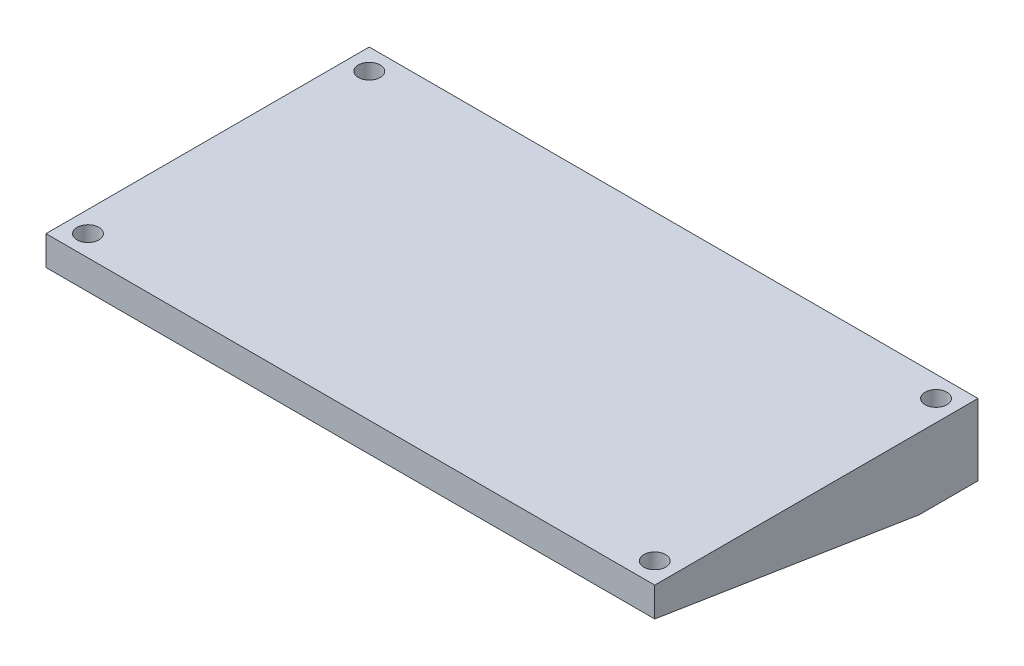
ISO-10303-21;
HEADER;
FILE_DESCRIPTION(('STEP AP214'),'2;1');
FILE_NAME('part.step','',(''),(''),'','','');
FILE_SCHEMA(('AUTOMOTIVE_DESIGN { 1 0 10303 214 1 1 1 1 }'));
ENDSEC;
DATA;
#1=APPLICATION_CONTEXT('core data for automotive mechanical design processes');
#2=APPLICATION_PROTOCOL_DEFINITION('international standard','automotive_design',2000,#1);
#3=PRODUCT_CONTEXT('',#1,'mechanical');
#4=PRODUCT('Part','Part','',(#3));
#5=PRODUCT_RELATED_PRODUCT_CATEGORY('part','',(#4));
#6=PRODUCT_DEFINITION_FORMATION('','',#4);
#7=PRODUCT_DEFINITION_CONTEXT('part definition',#1,'design');
#8=PRODUCT_DEFINITION('design','',#6,#7);
#9=PRODUCT_DEFINITION_SHAPE('','',#8);
#10=(LENGTH_UNIT() NAMED_UNIT(*) SI_UNIT(.MILLI.,.METRE.));
#11=(NAMED_UNIT(*) PLANE_ANGLE_UNIT() SI_UNIT($,.RADIAN.));
#12=(NAMED_UNIT(*) SI_UNIT($,.STERADIAN.) SOLID_ANGLE_UNIT());
#13=UNCERTAINTY_MEASURE_WITH_UNIT(LENGTH_MEASURE(1.E-05),#10,'distance_accuracy_value','');
#14=(GEOMETRIC_REPRESENTATION_CONTEXT(3) GLOBAL_UNCERTAINTY_ASSIGNED_CONTEXT((#13)) GLOBAL_UNIT_ASSIGNED_CONTEXT((#10,
#11,#12)) REPRESENTATION_CONTEXT('',''));
#15=CARTESIAN_POINT('',(0.,0.,0.));
#16=DIRECTION('',(0.,0.,1.));
#17=DIRECTION('',(1.,0.,0.));
#18=AXIS2_PLACEMENT_3D('',#15,#16,#17);
#19=CARTESIAN_POINT('',(0.,17.,0.));
#20=DIRECTION('',(1.,0.,0.));
#21=DIRECTION('',(0.,0.,-1.));
#22=AXIS2_PLACEMENT_3D('',#19,#20,#21);
#23=PLANE('',#22);
#24=DIRECTION('',(0.,0.,1.));
#25=VECTOR('',#24,1.);
#26=CARTESIAN_POINT('',(0.,0.,0.));
#27=LINE('',#26,#25);
#28=CARTESIAN_POINT('',(0.,0.,-77.));
#29=VERTEX_POINT('',#28);
#30=CARTESIAN_POINT('',(0.,0.,-63.0000000000014));
#31=VERTEX_POINT('',#30);
#32=EDGE_CURVE('E116',#29,#31,#27,.T.);
#33=ORIENTED_EDGE('',*,*,#32,.T.);
#34=DIRECTION('',(0.,0.156767544200705,0.987635528464463));
#35=VECTOR('',#34,1.);
#36=CARTESIAN_POINT('',(0.,10.,0.));
#37=LINE('',#36,#35);
#38=CARTESIAN_POINT('',(0.,10.,0.));
#39=VERTEX_POINT('',#38);
#40=EDGE_CURVE('E11',#31,#39,#37,.T.);
#41=ORIENTED_EDGE('',*,*,#40,.T.);
#42=DIRECTION('',(0.,-1.,0.));
#43=VECTOR('',#42,1.);
#44=CARTESIAN_POINT('',(0.,17.,0.));
#45=LINE('',#44,#43);
#46=CARTESIAN_POINT('',(0.,17.,0.));
#47=VERTEX_POINT('',#46);
#48=EDGE_CURVE('E84',#47,#39,#45,.T.);
#49=ORIENTED_EDGE('',*,*,#48,.F.);
#50=DIRECTION('',(0.,0.,1.));
#51=VECTOR('',#50,1.);
#52=CARTESIAN_POINT('',(0.,17.,0.));
#53=LINE('',#52,#51);
#54=CARTESIAN_POINT('',(0.,17.,-77.));
#55=VERTEX_POINT('',#54);
#56=EDGE_CURVE('E90',#55,#47,#53,.T.);
#57=ORIENTED_EDGE('',*,*,#56,.F.);
#58=DIRECTION('',(0.,-1.,0.));
#59=VECTOR('',#58,1.);
#60=CARTESIAN_POINT('',(0.,17.,-77.));
#61=LINE('',#60,#59);
#62=EDGE_CURVE('E111',#55,#29,#61,.T.);
#63=ORIENTED_EDGE('',*,*,#62,.T.);
#64=EDGE_LOOP('',(#33,#41,#49,#57,#63));
#65=FACE_BOUND('',#64,.T.);
#66=ADVANCED_FACE('F33',(#65),#23,.F.);
#67=CARTESIAN_POINT('',(0.,17.,0.));
#68=DIRECTION('',(0.,0.,-1.));
#69=DIRECTION('',(-1.,0.,0.));
#70=AXIS2_PLACEMENT_3D('',#67,#68,#69);
#71=PLANE('',#70);
#72=ORIENTED_EDGE('',*,*,#48,.T.);
#73=DIRECTION('',(1.,0.,0.));
#74=VECTOR('',#73,1.);
#75=CARTESIAN_POINT('',(145.,10.,0.));
#76=LINE('',#75,#74);
#77=CARTESIAN_POINT('',(145.,10.,0.));
#78=VERTEX_POINT('',#77);
#79=EDGE_CURVE('E102',#39,#78,#76,.T.);
#80=ORIENTED_EDGE('',*,*,#79,.T.);
#81=DIRECTION('',(0.,-1.,0.));
#82=VECTOR('',#81,1.);
#83=CARTESIAN_POINT('',(145.,17.,0.));
#84=LINE('',#83,#82);
#85=CARTESIAN_POINT('',(145.,17.,0.));
#86=VERTEX_POINT('',#85);
#87=EDGE_CURVE('E86',#86,#78,#84,.T.);
#88=ORIENTED_EDGE('',*,*,#87,.F.);
#89=DIRECTION('',(1.,0.,0.));
#90=VECTOR('',#89,1.);
#91=CARTESIAN_POINT('',(0.,17.,0.));
#92=LINE('',#91,#90);
#93=EDGE_CURVE('E79',#47,#86,#92,.T.);
#94=ORIENTED_EDGE('',*,*,#93,.F.);
#95=EDGE_LOOP('',(#72,#80,#88,#94));
#96=FACE_BOUND('',#95,.T.);
#97=ADVANCED_FACE('F81',(#96),#71,.F.);
#98=CARTESIAN_POINT('',(145.,17.,0.));
#99=DIRECTION('',(-1.,0.,0.));
#100=DIRECTION('',(0.,0.,1.));
#101=AXIS2_PLACEMENT_3D('',#98,#99,#100);
#102=PLANE('',#101);
#103=ORIENTED_EDGE('',*,*,#87,.T.);
#104=DIRECTION('',(0.,-0.156767544200705,-0.987635528464463));
#105=VECTOR('',#104,1.);
#106=CARTESIAN_POINT('',(145.,10.,0.));
#107=LINE('',#106,#105);
#108=CARTESIAN_POINT('',(145.,0.,-63.0000000000014));
#109=VERTEX_POINT('',#108);
#110=EDGE_CURVE('E55',#78,#109,#107,.T.);
#111=ORIENTED_EDGE('',*,*,#110,.T.);
#112=DIRECTION('',(0.,0.,-1.));
#113=VECTOR('',#112,1.);
#114=CARTESIAN_POINT('',(145.,0.,0.));
#115=LINE('',#114,#113);
#116=CARTESIAN_POINT('',(145.,0.,-77.));
#117=VERTEX_POINT('',#116);
#118=EDGE_CURVE('E114',#109,#117,#115,.T.);
#119=ORIENTED_EDGE('',*,*,#118,.T.);
#120=DIRECTION('',(0.,-1.,0.));
#121=VECTOR('',#120,1.);
#122=CARTESIAN_POINT('',(145.,17.,-77.));
#123=LINE('',#122,#121);
#124=CARTESIAN_POINT('',(145.,17.,-77.));
#125=VERTEX_POINT('',#124);
#126=EDGE_CURVE('E105',#125,#117,#123,.T.);
#127=ORIENTED_EDGE('',*,*,#126,.F.);
#128=DIRECTION('',(0.,0.,-1.));
#129=VECTOR('',#128,1.);
#130=CARTESIAN_POINT('',(145.,17.,0.));
#131=LINE('',#130,#129);
#132=EDGE_CURVE('E89',#86,#125,#131,.T.);
#133=ORIENTED_EDGE('',*,*,#132,.F.);
#134=EDGE_LOOP('',(#103,#111,#119,#127,#133));
#135=FACE_BOUND('',#134,.T.);
#136=ADVANCED_FACE('F178',(#135),#102,.F.);
#137=CARTESIAN_POINT('',(0.,17.,-77.));
#138=DIRECTION('',(0.,0.,1.));
#139=DIRECTION('',(1.,0.,0.));
#140=AXIS2_PLACEMENT_3D('',#137,#138,#139);
#141=PLANE('',#140);
#142=DIRECTION('',(-1.,0.,0.));
#143=VECTOR('',#142,1.);
#144=CARTESIAN_POINT('',(0.,0.,-77.));
#145=LINE('',#144,#143);
#146=EDGE_CURVE('E99',#117,#29,#145,.T.);
#147=ORIENTED_EDGE('',*,*,#146,.T.);
#148=ORIENTED_EDGE('',*,*,#62,.F.);
#149=DIRECTION('',(-1.,0.,0.));
#150=VECTOR('',#149,1.);
#151=CARTESIAN_POINT('',(0.,17.,-77.));
#152=LINE('',#151,#150);
#153=EDGE_CURVE('E95',#125,#55,#152,.T.);
#154=ORIENTED_EDGE('',*,*,#153,.F.);
#155=ORIENTED_EDGE('',*,*,#126,.T.);
#156=EDGE_LOOP('',(#147,#148,#154,#155));
#157=FACE_BOUND('',#156,.T.);
#158=ADVANCED_FACE('F157',(#157),#141,.F.);
#159=CARTESIAN_POINT('',(0.,17.,0.));
#160=DIRECTION('',(0.,-1.,0.));
#161=DIRECTION('',(0.,0.,-1.));
#162=AXIS2_PLACEMENT_3D('',#159,#160,#161);
#163=PLANE('',#162);
#164=CARTESIAN_POINT('',(140.,17.,-72.));
#165=DIRECTION('',(0.,1.,0.));
#166=DIRECTION('',(0.,0.,1.));
#167=AXIS2_PLACEMENT_3D('',#164,#165,#166);
#168=CIRCLE('',#167,2.59999999999999);
#169=CARTESIAN_POINT('',(140.,17.,-69.4));
#170=VERTEX_POINT('',#169);
#171=EDGE_CURVE('E127',#170,#170,#168,.T.);
#172=ORIENTED_EDGE('',*,*,#171,.F.);
#173=EDGE_LOOP('',(#172));
#174=FACE_BOUND('',#173,.T.);
#175=CARTESIAN_POINT('',(140.,17.,-5.));
#176=DIRECTION('',(0.,1.,0.));
#177=DIRECTION('',(0.,0.,1.));
#178=AXIS2_PLACEMENT_3D('',#175,#176,#177);
#179=CIRCLE('',#178,2.59999999999999);
#180=CARTESIAN_POINT('',(140.,17.,-2.40000000000001));
#181=VERTEX_POINT('',#180);
#182=EDGE_CURVE('E133',#181,#181,#179,.T.);
#183=ORIENTED_EDGE('',*,*,#182,.F.);
#184=EDGE_LOOP('',(#183));
#185=FACE_BOUND('',#184,.T.);
#186=CARTESIAN_POINT('',(5.,17.,-5.));
#187=DIRECTION('',(0.,1.,0.));
#188=DIRECTION('',(0.,0.,1.));
#189=AXIS2_PLACEMENT_3D('',#186,#187,#188);
#190=CIRCLE('',#189,2.6);
#191=CARTESIAN_POINT('',(5.,17.,-2.4));
#192=VERTEX_POINT('',#191);
#193=EDGE_CURVE('E139',#192,#192,#190,.T.);
#194=ORIENTED_EDGE('',*,*,#193,.F.);
#195=EDGE_LOOP('',(#194));
#196=FACE_BOUND('',#195,.T.);
#197=CARTESIAN_POINT('',(5.,17.,-72.));
#198=DIRECTION('',(0.,1.,0.));
#199=DIRECTION('',(0.,0.,1.));
#200=AXIS2_PLACEMENT_3D('',#197,#198,#199);
#201=CIRCLE('',#200,2.6);
#202=CARTESIAN_POINT('',(5.,17.,-69.4));
#203=VERTEX_POINT('',#202);
#204=EDGE_CURVE('E121',#203,#203,#201,.T.);
#205=ORIENTED_EDGE('',*,*,#204,.F.);
#206=EDGE_LOOP('',(#205));
#207=FACE_BOUND('',#206,.T.);
#208=ORIENTED_EDGE('',*,*,#56,.T.);
#209=ORIENTED_EDGE('',*,*,#93,.T.);
#210=ORIENTED_EDGE('',*,*,#132,.T.);
#211=ORIENTED_EDGE('',*,*,#153,.T.);
#212=EDGE_LOOP('',(#208,#209,#210,#211));
#213=FACE_BOUND('',#212,.T.);
#214=ADVANCED_FACE('F93',(#174,#185,#196,#207,#213),#163,.F.);
#215=CARTESIAN_POINT('',(0.,0.,0.));
#216=DIRECTION('',(0.,-1.,0.));
#217=DIRECTION('',(0.,0.,-1.));
#218=AXIS2_PLACEMENT_3D('',#215,#216,#217);
#219=PLANE('',#218);
#220=ORIENTED_EDGE('',*,*,#118,.F.);
#221=DIRECTION('',(-1.,0.,0.));
#222=VECTOR('',#221,1.);
#223=CARTESIAN_POINT('',(0.,0.,-63.0000000000014));
#224=LINE('',#223,#222);
#225=EDGE_CURVE('E41',#109,#31,#224,.T.);
#226=ORIENTED_EDGE('',*,*,#225,.T.);
#227=ORIENTED_EDGE('',*,*,#32,.F.);
#228=ORIENTED_EDGE('',*,*,#146,.F.);
#229=EDGE_LOOP('',(#220,#226,#227,#228));
#230=FACE_BOUND('',#229,.T.);
#231=ADVANCED_FACE('F156',(#230),#219,.T.);
#232=CARTESIAN_POINT('',(0.,10.,0.));
#233=DIRECTION('',(0.,-0.987635528464463,0.156767544200705));
#234=DIRECTION('',(-1.,0.,0.));
#235=AXIS2_PLACEMENT_3D('',#232,#233,#234);
#236=PLANE('',#235);
#237=ORIENTED_EDGE('',*,*,#40,.F.);
#238=ORIENTED_EDGE('',*,*,#225,.F.);
#239=ORIENTED_EDGE('',*,*,#110,.F.);
#240=ORIENTED_EDGE('',*,*,#79,.F.);
#241=EDGE_LOOP('',(#237,#238,#239,#240));
#242=FACE_BOUND('',#241,.T.);
#243=ADVANCED_FACE('F35',(#242),#236,.T.);
#244=CARTESIAN_POINT('',(5.,12.,-72.));
#245=DIRECTION('',(0.,1.,0.));
#246=DIRECTION('',(0.,0.,1.));
#247=AXIS2_PLACEMENT_3D('',#244,#245,#246);
#248=CYLINDRICAL_SURFACE('',#247,2.6);
#249=CARTESIAN_POINT('',(5.,12.,-72.));
#250=DIRECTION('',(0.,1.,0.));
#251=DIRECTION('',(0.,0.,1.));
#252=AXIS2_PLACEMENT_3D('',#249,#250,#251);
#253=CIRCLE('',#252,2.6);
#254=CARTESIAN_POINT('',(5.,12.,-69.4));
#255=VERTEX_POINT('',#254);
#256=EDGE_CURVE('E118',#255,#255,#253,.T.);
#257=ORIENTED_EDGE('',*,*,#256,.F.);
#258=EDGE_LOOP('',(#257));
#259=FACE_BOUND('',#258,.T.);
#260=ORIENTED_EDGE('',*,*,#204,.T.);
#261=EDGE_LOOP('',(#260));
#262=FACE_BOUND('',#261,.T.);
#263=ADVANCED_FACE('F162',(#259,#262),#248,.F.);
#264=CARTESIAN_POINT('',(0.,12.,0.));
#265=DIRECTION('',(0.,1.,0.));
#266=DIRECTION('',(0.,0.,1.));
#267=AXIS2_PLACEMENT_3D('',#264,#265,#266);
#268=PLANE('',#267);
#269=ORIENTED_EDGE('',*,*,#256,.T.);
#270=EDGE_LOOP('',(#269));
#271=FACE_BOUND('',#270,.T.);
#272=ADVANCED_FACE('F150',(#271),#268,.T.);
#273=CARTESIAN_POINT('',(5.,12.,-5.));
#274=DIRECTION('',(0.,1.,0.));
#275=DIRECTION('',(0.,0.,1.));
#276=AXIS2_PLACEMENT_3D('',#273,#274,#275);
#277=CYLINDRICAL_SURFACE('',#276,2.6);
#278=CARTESIAN_POINT('',(5.,12.,-5.));
#279=DIRECTION('',(0.,1.,0.));
#280=DIRECTION('',(0.,0.,1.));
#281=AXIS2_PLACEMENT_3D('',#278,#279,#280);
#282=CIRCLE('',#281,2.6);
#283=CARTESIAN_POINT('',(5.,12.,-2.4));
#284=VERTEX_POINT('',#283);
#285=EDGE_CURVE('E124',#284,#284,#282,.T.);
#286=ORIENTED_EDGE('',*,*,#285,.F.);
#287=EDGE_LOOP('',(#286));
#288=FACE_BOUND('',#287,.T.);
#289=ORIENTED_EDGE('',*,*,#193,.T.);
#290=EDGE_LOOP('',(#289));
#291=FACE_BOUND('',#290,.T.);
#292=ADVANCED_FACE('F147',(#288,#291),#277,.F.);
#293=CARTESIAN_POINT('',(0.,12.,0.));
#294=DIRECTION('',(0.,1.,0.));
#295=DIRECTION('',(0.,0.,1.));
#296=AXIS2_PLACEMENT_3D('',#293,#294,#295);
#297=PLANE('',#296);
#298=ORIENTED_EDGE('',*,*,#285,.T.);
#299=EDGE_LOOP('',(#298));
#300=FACE_BOUND('',#299,.T.);
#301=ADVANCED_FACE('F145',(#300),#297,.T.);
#302=CARTESIAN_POINT('',(140.,12.,-5.));
#303=DIRECTION('',(0.,1.,0.));
#304=DIRECTION('',(0.,0.,1.));
#305=AXIS2_PLACEMENT_3D('',#302,#303,#304);
#306=CYLINDRICAL_SURFACE('',#305,2.59999999999999);
#307=CARTESIAN_POINT('',(140.,12.,-5.));
#308=DIRECTION('',(0.,1.,0.));
#309=DIRECTION('',(0.,0.,1.));
#310=AXIS2_PLACEMENT_3D('',#307,#308,#309);
#311=CIRCLE('',#310,2.59999999999999);
#312=CARTESIAN_POINT('',(140.,12.,-2.40000000000001));
#313=VERTEX_POINT('',#312);
#314=EDGE_CURVE('E136',#313,#313,#311,.T.);
#315=ORIENTED_EDGE('',*,*,#314,.F.);
#316=EDGE_LOOP('',(#315));
#317=FACE_BOUND('',#316,.T.);
#318=ORIENTED_EDGE('',*,*,#182,.T.);
#319=EDGE_LOOP('',(#318));
#320=FACE_BOUND('',#319,.T.);
#321=ADVANCED_FACE('F228',(#317,#320),#306,.F.);
#322=CARTESIAN_POINT('',(0.,12.,0.));
#323=DIRECTION('',(0.,1.,0.));
#324=DIRECTION('',(0.,0.,1.));
#325=AXIS2_PLACEMENT_3D('',#322,#323,#324);
#326=PLANE('',#325);
#327=ORIENTED_EDGE('',*,*,#314,.T.);
#328=EDGE_LOOP('',(#327));
#329=FACE_BOUND('',#328,.T.);
#330=ADVANCED_FACE('F237',(#329),#326,.T.);
#331=CARTESIAN_POINT('',(140.,12.,-72.));
#332=DIRECTION('',(0.,1.,0.));
#333=DIRECTION('',(0.,0.,1.));
#334=AXIS2_PLACEMENT_3D('',#331,#332,#333);
#335=CYLINDRICAL_SURFACE('',#334,2.59999999999999);
#336=CARTESIAN_POINT('',(140.,12.,-72.));
#337=DIRECTION('',(0.,1.,0.));
#338=DIRECTION('',(0.,0.,1.));
#339=AXIS2_PLACEMENT_3D('',#336,#337,#338);
#340=CIRCLE('',#339,2.59999999999999);
#341=CARTESIAN_POINT('',(140.,12.,-69.4));
#342=VERTEX_POINT('',#341);
#343=EDGE_CURVE('E130',#342,#342,#340,.T.);
#344=ORIENTED_EDGE('',*,*,#343,.F.);
#345=EDGE_LOOP('',(#344));
#346=FACE_BOUND('',#345,.T.);
#347=ORIENTED_EDGE('',*,*,#171,.T.);
#348=EDGE_LOOP('',(#347));
#349=FACE_BOUND('',#348,.T.);
#350=ADVANCED_FACE('F247',(#346,#349),#335,.F.);
#351=CARTESIAN_POINT('',(0.,12.,0.));
#352=DIRECTION('',(0.,1.,0.));
#353=DIRECTION('',(0.,0.,1.));
#354=AXIS2_PLACEMENT_3D('',#351,#352,#353);
#355=PLANE('',#354);
#356=ORIENTED_EDGE('',*,*,#343,.T.);
#357=EDGE_LOOP('',(#356));
#358=FACE_BOUND('',#357,.T.);
#359=ADVANCED_FACE('F257',(#358),#355,.T.);
#360=CLOSED_SHELL('',(#66,#97,#136,#158,#214,#231,#243,#263,#272,#292,#301,#321,#330,#350,#359));
#361=MANIFOLD_SOLID_BREP('B2',#360);
#362=ADVANCED_BREP_SHAPE_REPRESENTATION('',(#18,#361),#14);
#363=SHAPE_DEFINITION_REPRESENTATION(#9,#362);
ENDSEC;
END-ISO-10303-21;
